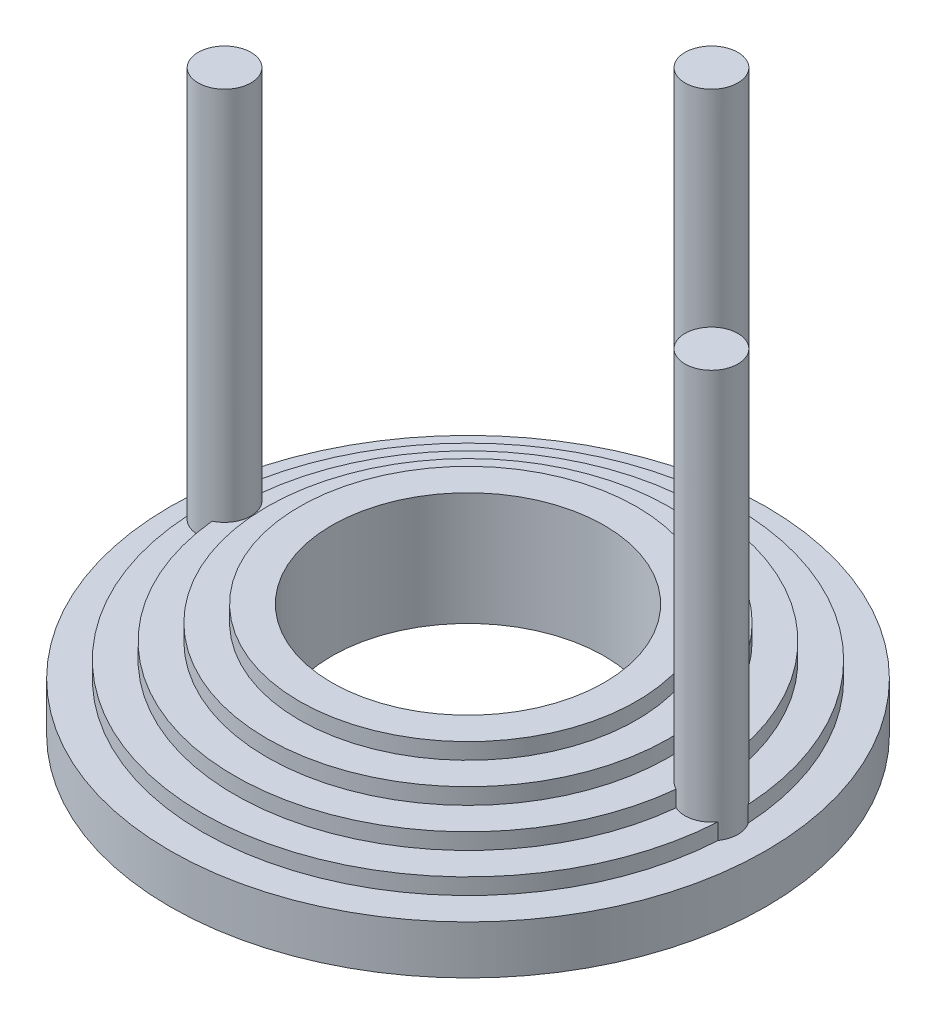
ISO-10303-21;
HEADER;
FILE_DESCRIPTION(('STEP AP214'),'2;1');
FILE_NAME('part.step','',(''),(''),'','','');
FILE_SCHEMA(('AUTOMOTIVE_DESIGN { 1 0 10303 214 1 1 1 1 }'));
ENDSEC;
DATA;
#1=APPLICATION_CONTEXT('core data for automotive mechanical design processes');
#2=APPLICATION_PROTOCOL_DEFINITION('international standard','automotive_design',2000,#1);
#3=PRODUCT_CONTEXT('',#1,'mechanical');
#4=PRODUCT('Part','Part','',(#3));
#5=PRODUCT_RELATED_PRODUCT_CATEGORY('part','',(#4));
#6=PRODUCT_DEFINITION_FORMATION('','',#4);
#7=PRODUCT_DEFINITION_CONTEXT('part definition',#1,'design');
#8=PRODUCT_DEFINITION('design','',#6,#7);
#9=PRODUCT_DEFINITION_SHAPE('','',#8);
#10=(LENGTH_UNIT() NAMED_UNIT(*) SI_UNIT(.MILLI.,.METRE.));
#11=(NAMED_UNIT(*) PLANE_ANGLE_UNIT() SI_UNIT($,.RADIAN.));
#12=(NAMED_UNIT(*) SI_UNIT($,.STERADIAN.) SOLID_ANGLE_UNIT());
#13=UNCERTAINTY_MEASURE_WITH_UNIT(LENGTH_MEASURE(1.E-05),#10,'distance_accuracy_value','');
#14=(GEOMETRIC_REPRESENTATION_CONTEXT(3) GLOBAL_UNCERTAINTY_ASSIGNED_CONTEXT((#13)) GLOBAL_UNIT_ASSIGNED_CONTEXT((#10,
#11,#12)) REPRESENTATION_CONTEXT('',''));
#15=CARTESIAN_POINT('',(0.,0.,0.));
#16=DIRECTION('',(0.,0.,1.));
#17=DIRECTION('',(1.,0.,0.));
#18=AXIS2_PLACEMENT_3D('',#15,#16,#17);
#19=CARTESIAN_POINT('',(-63.74799991,23.4540505717349,0.));
#20=DIRECTION('',(0.,-1.,0.));
#21=DIRECTION('',(0.,0.,-1.));
#22=AXIS2_PLACEMENT_3D('',#19,#20,#21);
#23=PLANE('',#22);
#24=CARTESIAN_POINT('',(0.,23.4540505717349,0.));
#25=DIRECTION('',(0.,-1.,0.));
#26=DIRECTION('',(0.,0.,-1.));
#27=AXIS2_PLACEMENT_3D('',#24,#25,#26);
#28=CIRCLE('',#27,71.50999988);
#29=CARTESIAN_POINT('',(0.,23.4540505717349,-71.50999988));
#30=VERTEX_POINT('',#29);
#31=EDGE_CURVE('E217',#30,#30,#28,.T.);
#32=ORIENTED_EDGE('',*,*,#31,.F.);
#33=EDGE_LOOP('',(#32));
#34=FACE_BOUND('',#33,.T.);
#35=CARTESIAN_POINT('',(0.,23.4540505717349,-58.42));
#36=DIRECTION('',(0.,1.,0.));
#37=DIRECTION('',(0.,0.,1.));
#38=AXIS2_PLACEMENT_3D('',#35,#36,#37);
#39=CIRCLE('',#38,6.35);
#40=CARTESIAN_POINT('',(3.60734900758684,23.4540505717349,-63.6458523838186));
#41=VERTEX_POINT('',#40);
#42=CARTESIAN_POINT('',(-3.60734900758684,23.4540505717349,-63.6458523838186));
#43=VERTEX_POINT('',#42);
#44=EDGE_CURVE('E47',#41,#43,#39,.T.);
#45=ORIENTED_EDGE('',*,*,#44,.F.);
#46=CARTESIAN_POINT('',(0.,23.4540505717349,0.));
#47=DIRECTION('',(0.,-1.,0.));
#48=DIRECTION('',(0.,0.,-1.));
#49=AXIS2_PLACEMENT_3D('',#46,#47,#48);
#50=CIRCLE('',#49,63.74799991);
#51=CARTESIAN_POINT('',(63.6458523838186,23.4540505717349,-3.60734900758684));
#52=VERTEX_POINT('',#51);
#53=EDGE_CURVE('E218',#41,#52,#50,.T.);
#54=ORIENTED_EDGE('',*,*,#53,.T.);
#55=CARTESIAN_POINT('',(58.42,23.4540505717349,0.));
#56=DIRECTION('',(0.,1.,0.));
#57=DIRECTION('',(0.,0.,-1.));
#58=AXIS2_PLACEMENT_3D('',#55,#56,#57);
#59=CIRCLE('',#58,6.35);
#60=CARTESIAN_POINT('',(63.6458523838186,23.4540505717349,3.60734900758684));
#61=VERTEX_POINT('',#60);
#62=EDGE_CURVE('E161',#61,#52,#59,.T.);
#63=ORIENTED_EDGE('',*,*,#62,.F.);
#64=CARTESIAN_POINT('',(-63.6458523838186,23.4540505717349,3.60734900758684));
#65=VERTEX_POINT('',#64);
#66=EDGE_CURVE('E213',#61,#65,#50,.T.);
#67=ORIENTED_EDGE('',*,*,#66,.T.);
#68=CARTESIAN_POINT('',(-58.42,23.4540505717349,0.));
#69=DIRECTION('',(0.,1.,0.));
#70=DIRECTION('',(0.,0.,1.));
#71=AXIS2_PLACEMENT_3D('',#68,#69,#70);
#72=CIRCLE('',#71,6.35);
#73=CARTESIAN_POINT('',(-63.6458523838186,23.4540505717349,-3.60734900758684));
#74=VERTEX_POINT('',#73);
#75=EDGE_CURVE('E182',#74,#65,#72,.T.);
#76=ORIENTED_EDGE('',*,*,#75,.F.);
#77=EDGE_CURVE('E215',#74,#43,#50,.T.);
#78=ORIENTED_EDGE('',*,*,#77,.T.);
#79=EDGE_LOOP('',(#45,#54,#63,#67,#76,#78));
#80=FACE_BOUND('',#79,.T.);
#81=ADVANCED_FACE('F32',(#34,#80),#23,.F.);
#82=CARTESIAN_POINT('',(0.,0.,0.));
#83=DIRECTION('',(0.,-1.,0.));
#84=DIRECTION('',(0.,0.,-1.));
#85=AXIS2_PLACEMENT_3D('',#82,#83,#84);
#86=CYLINDRICAL_SURFACE('',#85,63.74799991);
#87=DIRECTION('',(0.,-1.,0.));
#88=VECTOR('',#87,1.);
#89=CARTESIAN_POINT('',(3.60734900758683,72.3490505717349,-63.6458523838186));
#90=LINE('',#89,#88);
#91=CARTESIAN_POINT('',(3.60734900758683,27.3350505717349,-63.6458523838186));
#92=VERTEX_POINT('',#91);
#93=EDGE_CURVE('E158',#92,#41,#90,.T.);
#94=ORIENTED_EDGE('',*,*,#93,.F.);
#95=CARTESIAN_POINT('',(0.,27.3350505717349,0.));
#96=DIRECTION('',(0.,-1.,0.));
#97=DIRECTION('',(0.,0.,-1.));
#98=AXIS2_PLACEMENT_3D('',#95,#96,#97);
#99=CIRCLE('',#98,63.74799991);
#100=CARTESIAN_POINT('',(63.6458523838186,27.3350505717349,-3.60734900758683));
#101=VERTEX_POINT('',#100);
#102=EDGE_CURVE('E214',#92,#101,#99,.T.);
#103=ORIENTED_EDGE('',*,*,#102,.T.);
#104=DIRECTION('',(0.,-1.,0.));
#105=VECTOR('',#104,1.);
#106=CARTESIAN_POINT('',(63.6458523838186,72.3490505717349,-3.60734900758684));
#107=LINE('',#106,#105);
#108=EDGE_CURVE('E176',#52,#101,#107,.F.);
#109=ORIENTED_EDGE('',*,*,#108,.F.);
#110=ORIENTED_EDGE('',*,*,#53,.F.);
#111=EDGE_LOOP('',(#94,#103,#109,#110));
#112=FACE_BOUND('',#111,.T.);
#113=ADVANCED_FACE('F267',(#112),#86,.T.);
#114=DIRECTION('',(0.,-1.,0.));
#115=VECTOR('',#114,1.);
#116=CARTESIAN_POINT('',(-3.60734900758683,72.3490505717349,-63.6458523838186));
#117=LINE('',#116,#115);
#118=CARTESIAN_POINT('',(-3.60734900758683,27.3350505717349,-63.6458523838186));
#119=VERTEX_POINT('',#118);
#120=EDGE_CURVE('E55',#43,#119,#117,.F.);
#121=ORIENTED_EDGE('',*,*,#120,.F.);
#122=ORIENTED_EDGE('',*,*,#77,.F.);
#123=DIRECTION('',(0.,-1.,0.));
#124=VECTOR('',#123,1.);
#125=CARTESIAN_POINT('',(-63.6458523838186,72.3490505717349,-3.60734900758684));
#126=LINE('',#125,#124);
#127=CARTESIAN_POINT('',(-63.6458523838186,27.3350505717349,-3.60734900758683));
#128=VERTEX_POINT('',#127);
#129=EDGE_CURVE('E201',#128,#74,#126,.T.);
#130=ORIENTED_EDGE('',*,*,#129,.F.);
#131=EDGE_CURVE('E211',#128,#119,#99,.T.);
#132=ORIENTED_EDGE('',*,*,#131,.T.);
#133=EDGE_LOOP('',(#121,#122,#130,#132));
#134=FACE_BOUND('',#133,.T.);
#135=ADVANCED_FACE('F268',(#134),#86,.T.);
#136=CARTESIAN_POINT('',(-55.98599994,27.3350505717349,0.));
#137=DIRECTION('',(0.,-1.,0.));
#138=DIRECTION('',(0.,0.,-1.));
#139=AXIS2_PLACEMENT_3D('',#136,#137,#138);
#140=PLANE('',#139);
#141=CARTESIAN_POINT('',(0.,27.3350505717349,-58.42));
#142=DIRECTION('',(0.,-1.,0.));
#143=DIRECTION('',(0.,0.,-1.));
#144=AXIS2_PLACEMENT_3D('',#141,#142,#143);
#145=CIRCLE('',#144,6.35);
#146=CARTESIAN_POINT('',(-5.73396130115922,27.3350505717349,-55.6915961081965));
#147=VERTEX_POINT('',#146);
#148=EDGE_CURVE('E146',#119,#147,#145,.F.);
#149=ORIENTED_EDGE('',*,*,#148,.F.);
#150=ORIENTED_EDGE('',*,*,#131,.F.);
#151=CARTESIAN_POINT('',(-58.42,27.3350505717349,0.));
#152=DIRECTION('',(0.,-1.,0.));
#153=DIRECTION('',(0.,0.,-1.));
#154=AXIS2_PLACEMENT_3D('',#151,#152,#153);
#155=CIRCLE('',#154,6.35);
#156=CARTESIAN_POINT('',(-55.6915961081965,27.3350505717349,-5.73396130115923));
#157=VERTEX_POINT('',#156);
#158=EDGE_CURVE('E194',#157,#128,#155,.F.);
#159=ORIENTED_EDGE('',*,*,#158,.F.);
#160=CARTESIAN_POINT('',(0.,27.3350505717349,0.));
#161=DIRECTION('',(0.,-1.,0.));
#162=DIRECTION('',(0.,0.,-1.));
#163=AXIS2_PLACEMENT_3D('',#160,#161,#162);
#164=CIRCLE('',#163,55.98599994);
#165=EDGE_CURVE('E208',#157,#147,#164,.T.);
#166=ORIENTED_EDGE('',*,*,#165,.T.);
#167=EDGE_LOOP('',(#149,#150,#159,#166));
#168=FACE_BOUND('',#167,.T.);
#169=ADVANCED_FACE('F272',(#168),#140,.F.);
#170=CARTESIAN_POINT('',(5.73396130115922,27.3350505717349,-55.6915961081965));
#171=VERTEX_POINT('',#170);
#172=EDGE_CURVE('E140',#171,#92,#145,.F.);
#173=ORIENTED_EDGE('',*,*,#172,.F.);
#174=CARTESIAN_POINT('',(55.6915961081965,27.3350505717349,-5.73396130115923));
#175=VERTEX_POINT('',#174);
#176=EDGE_CURVE('E137',#171,#175,#164,.T.);
#177=ORIENTED_EDGE('',*,*,#176,.T.);
#178=CARTESIAN_POINT('',(58.42,27.3350505717349,0.));
#179=DIRECTION('',(0.,-1.,0.));
#180=DIRECTION('',(0.,0.,-1.));
#181=AXIS2_PLACEMENT_3D('',#178,#179,#180);
#182=CIRCLE('',#181,6.35);
#183=EDGE_CURVE('E172',#101,#175,#182,.F.);
#184=ORIENTED_EDGE('',*,*,#183,.F.);
#185=ORIENTED_EDGE('',*,*,#102,.F.);
#186=EDGE_LOOP('',(#173,#177,#184,#185));
#187=FACE_BOUND('',#186,.T.);
#188=ADVANCED_FACE('F249',(#187),#140,.F.);
#189=CARTESIAN_POINT('',(0.,0.,0.));
#190=DIRECTION('',(0.,-1.,0.));
#191=DIRECTION('',(0.,0.,-1.));
#192=AXIS2_PLACEMENT_3D('',#189,#190,#191);
#193=CYLINDRICAL_SURFACE('',#192,55.98599994);
#194=DIRECTION('',(0.,-1.,0.));
#195=VECTOR('',#194,1.);
#196=CARTESIAN_POINT('',(5.73396130115922,72.3490505717349,-55.6915961081965));
#197=LINE('',#196,#195);
#198=CARTESIAN_POINT('',(5.7339613011592,31.2160506837349,-55.6915961081965));
#199=VERTEX_POINT('',#198);
#200=EDGE_CURVE('E135',#199,#171,#197,.T.);
#201=ORIENTED_EDGE('',*,*,#200,.F.);
#202=CARTESIAN_POINT('',(0.,31.2160506837349,0.));
#203=DIRECTION('',(0.,-1.,0.));
#204=DIRECTION('',(0.,0.,-1.));
#205=AXIS2_PLACEMENT_3D('',#202,#203,#204);
#206=CIRCLE('',#205,55.98599994);
#207=CARTESIAN_POINT('',(55.6915961081965,31.2160506837349,-5.7339613011592));
#208=VERTEX_POINT('',#207);
#209=EDGE_CURVE('E122',#199,#208,#206,.T.);
#210=ORIENTED_EDGE('',*,*,#209,.T.);
#211=DIRECTION('',(0.,-1.,0.));
#212=VECTOR('',#211,1.);
#213=CARTESIAN_POINT('',(55.6915961081965,72.3490505717349,-5.73396130115923));
#214=LINE('',#213,#212);
#215=EDGE_CURVE('E165',#175,#208,#214,.F.);
#216=ORIENTED_EDGE('',*,*,#215,.F.);
#217=ORIENTED_EDGE('',*,*,#176,.F.);
#218=EDGE_LOOP('',(#201,#210,#216,#217));
#219=FACE_BOUND('',#218,.T.);
#220=ADVANCED_FACE('F136',(#219),#193,.T.);
#221=DIRECTION('',(0.,-1.,0.));
#222=VECTOR('',#221,1.);
#223=CARTESIAN_POINT('',(-5.73396130115922,72.3490505717349,-55.6915961081965));
#224=LINE('',#223,#222);
#225=CARTESIAN_POINT('',(-5.7339613011592,31.2160506837349,-55.6915961081965));
#226=VERTEX_POINT('',#225);
#227=EDGE_CURVE('E141',#147,#226,#224,.F.);
#228=ORIENTED_EDGE('',*,*,#227,.F.);
#229=ORIENTED_EDGE('',*,*,#165,.F.);
#230=DIRECTION('',(0.,-1.,0.));
#231=VECTOR('',#230,1.);
#232=CARTESIAN_POINT('',(-55.6915961081965,72.3490505717349,-5.73396130115923));
#233=LINE('',#232,#231);
#234=CARTESIAN_POINT('',(-55.6915961081965,31.2160506837349,-5.7339613011592));
#235=VERTEX_POINT('',#234);
#236=EDGE_CURVE('E191',#235,#157,#233,.T.);
#237=ORIENTED_EDGE('',*,*,#236,.F.);
#238=EDGE_CURVE('E130',#235,#226,#206,.T.);
#239=ORIENTED_EDGE('',*,*,#238,.T.);
#240=EDGE_LOOP('',(#228,#229,#237,#239));
#241=FACE_BOUND('',#240,.T.);
#242=ADVANCED_FACE('F273',(#241),#193,.T.);
#243=CARTESIAN_POINT('',(-48.22399997,31.2160506837349,0.));
#244=DIRECTION('',(0.,-1.,0.));
#245=DIRECTION('',(0.,0.,-1.));
#246=AXIS2_PLACEMENT_3D('',#243,#244,#245);
#247=PLANE('',#246);
#248=CARTESIAN_POINT('',(0.,31.2160506837349,0.));
#249=DIRECTION('',(0.,-1.,0.));
#250=DIRECTION('',(0.,0.,-1.));
#251=AXIS2_PLACEMENT_3D('',#248,#249,#250);
#252=CIRCLE('',#251,48.22399997);
#253=CARTESIAN_POINT('',(0.,31.2160506837349,-48.22399997));
#254=VERTEX_POINT('',#253);
#255=EDGE_CURVE('E204',#254,#254,#252,.T.);
#256=ORIENTED_EDGE('',*,*,#255,.T.);
#257=EDGE_LOOP('',(#256));
#258=FACE_BOUND('',#257,.T.);
#259=CARTESIAN_POINT('',(0.,31.2160506837349,-58.42));
#260=DIRECTION('',(0.,-1.,0.));
#261=DIRECTION('',(0.,0.,-1.));
#262=AXIS2_PLACEMENT_3D('',#259,#260,#261);
#263=CIRCLE('',#262,6.35);
#264=EDGE_CURVE('E11',#226,#199,#263,.F.);
#265=ORIENTED_EDGE('',*,*,#264,.F.);
#266=ORIENTED_EDGE('',*,*,#238,.F.);
#267=CARTESIAN_POINT('',(-58.42,31.2160506837349,0.));
#268=DIRECTION('',(0.,-1.,0.));
#269=DIRECTION('',(0.,0.,-1.));
#270=AXIS2_PLACEMENT_3D('',#267,#268,#269);
#271=CIRCLE('',#270,6.35);
#272=CARTESIAN_POINT('',(-55.6915961081965,31.2160506837349,5.7339613011592));
#273=VERTEX_POINT('',#272);
#274=EDGE_CURVE('E239',#273,#235,#271,.F.);
#275=ORIENTED_EDGE('',*,*,#274,.F.);
#276=CARTESIAN_POINT('',(55.6915961081965,31.2160506837349,5.7339613011592));
#277=VERTEX_POINT('',#276);
#278=EDGE_CURVE('E131',#277,#273,#206,.T.);
#279=ORIENTED_EDGE('',*,*,#278,.F.);
#280=CARTESIAN_POINT('',(58.42,31.2160506837349,0.));
#281=DIRECTION('',(0.,-1.,0.));
#282=DIRECTION('',(0.,0.,-1.));
#283=AXIS2_PLACEMENT_3D('',#280,#281,#282);
#284=CIRCLE('',#283,6.35);
#285=EDGE_CURVE('E40',#208,#277,#284,.F.);
#286=ORIENTED_EDGE('',*,*,#285,.F.);
#287=ORIENTED_EDGE('',*,*,#209,.F.);
#288=EDGE_LOOP('',(#265,#266,#275,#279,#286,#287));
#289=FACE_BOUND('',#288,.T.);
#290=ADVANCED_FACE('F124',(#258,#289),#247,.F.);
#291=DIRECTION('',(0.,-1.,0.));
#292=VECTOR('',#291,1.);
#293=CARTESIAN_POINT('',(63.6458523838186,72.3490505717349,3.60734900758684));
#294=LINE('',#293,#292);
#295=CARTESIAN_POINT('',(63.6458523838186,27.3350505717349,3.60734900758683));
#296=VERTEX_POINT('',#295);
#297=EDGE_CURVE('E179',#296,#61,#294,.T.);
#298=ORIENTED_EDGE('',*,*,#297,.F.);
#299=CARTESIAN_POINT('',(-63.6458523838186,27.3350505717349,3.60734900758683));
#300=VERTEX_POINT('',#299);
#301=EDGE_CURVE('E210',#296,#300,#99,.T.);
#302=ORIENTED_EDGE('',*,*,#301,.T.);
#303=DIRECTION('',(0.,-1.,0.));
#304=VECTOR('',#303,1.);
#305=CARTESIAN_POINT('',(-63.6458523838186,72.3490505717349,3.60734900758684));
#306=LINE('',#305,#304);
#307=EDGE_CURVE('E198',#65,#300,#306,.F.);
#308=ORIENTED_EDGE('',*,*,#307,.F.);
#309=ORIENTED_EDGE('',*,*,#66,.F.);
#310=EDGE_LOOP('',(#298,#302,#308,#309));
#311=FACE_BOUND('',#310,.T.);
#312=ADVANCED_FACE('F265',(#311),#86,.T.);
#313=CARTESIAN_POINT('',(55.6915961081965,27.3350505717349,5.73396130115923));
#314=VERTEX_POINT('',#313);
#315=EDGE_CURVE('E175',#314,#296,#182,.F.);
#316=ORIENTED_EDGE('',*,*,#315,.F.);
#317=CARTESIAN_POINT('',(-55.6915961081965,27.3350505717349,5.73396130115923));
#318=VERTEX_POINT('',#317);
#319=EDGE_CURVE('E207',#314,#318,#164,.T.);
#320=ORIENTED_EDGE('',*,*,#319,.T.);
#321=EDGE_CURVE('E197',#300,#318,#155,.F.);
#322=ORIENTED_EDGE('',*,*,#321,.F.);
#323=ORIENTED_EDGE('',*,*,#301,.F.);
#324=EDGE_LOOP('',(#316,#320,#322,#323));
#325=FACE_BOUND('',#324,.T.);
#326=ADVANCED_FACE('F254',(#325),#140,.F.);
#327=DIRECTION('',(0.,-1.,0.));
#328=VECTOR('',#327,1.);
#329=CARTESIAN_POINT('',(55.6915961081965,72.3490505717349,5.73396130115923));
#330=LINE('',#329,#328);
#331=EDGE_CURVE('E169',#277,#314,#330,.T.);
#332=ORIENTED_EDGE('',*,*,#331,.F.);
#333=ORIENTED_EDGE('',*,*,#278,.T.);
#334=DIRECTION('',(0.,-1.,0.));
#335=VECTOR('',#334,1.);
#336=CARTESIAN_POINT('',(-55.6915961081965,72.3490505717349,5.73396130115923));
#337=LINE('',#336,#335);
#338=EDGE_CURVE('E186',#318,#273,#337,.F.);
#339=ORIENTED_EDGE('',*,*,#338,.F.);
#340=ORIENTED_EDGE('',*,*,#319,.F.);
#341=EDGE_LOOP('',(#332,#333,#339,#340));
#342=FACE_BOUND('',#341,.T.);
#343=ADVANCED_FACE('F258',(#342),#193,.T.);
#344=CARTESIAN_POINT('',(0.,0.,0.));
#345=DIRECTION('',(0.,-1.,0.));
#346=DIRECTION('',(0.,0.,-1.));
#347=AXIS2_PLACEMENT_3D('',#344,#345,#346);
#348=CYLINDRICAL_SURFACE('',#347,48.22399997);
#349=ORIENTED_EDGE('',*,*,#255,.F.);
#350=EDGE_LOOP('',(#349));
#351=FACE_BOUND('',#350,.T.);
#352=CARTESIAN_POINT('',(0.,35.0970507957349,0.));
#353=DIRECTION('',(0.,-1.,0.));
#354=DIRECTION('',(0.,0.,-1.));
#355=AXIS2_PLACEMENT_3D('',#352,#353,#354);
#356=CIRCLE('',#355,48.22399997);
#357=CARTESIAN_POINT('',(0.,35.0970507957349,-48.22399997));
#358=VERTEX_POINT('',#357);
#359=EDGE_CURVE('E236',#358,#358,#356,.T.);
#360=ORIENTED_EDGE('',*,*,#359,.T.);
#361=EDGE_LOOP('',(#360));
#362=FACE_BOUND('',#361,.T.);
#363=ADVANCED_FACE('F34',(#351,#362),#348,.T.);
#364=CARTESIAN_POINT('',(-48.22399997,35.0970507957349,0.));
#365=DIRECTION('',(0.,-1.,0.));
#366=DIRECTION('',(0.,0.,-1.));
#367=AXIS2_PLACEMENT_3D('',#364,#365,#366);
#368=PLANE('',#367);
#369=ORIENTED_EDGE('',*,*,#359,.F.);
#370=EDGE_LOOP('',(#369));
#371=FACE_BOUND('',#370,.T.);
#372=CARTESIAN_POINT('',(0.,35.0970507957349,0.));
#373=DIRECTION('',(0.,-1.,0.));
#374=DIRECTION('',(0.,0.,-1.));
#375=AXIS2_PLACEMENT_3D('',#372,#373,#374);
#376=CIRCLE('',#375,40.462);
#377=CARTESIAN_POINT('',(0.,35.0970507957349,-40.462));
#378=VERTEX_POINT('',#377);
#379=EDGE_CURVE('E233',#378,#378,#376,.T.);
#380=ORIENTED_EDGE('',*,*,#379,.T.);
#381=EDGE_LOOP('',(#380));
#382=FACE_BOUND('',#381,.T.);
#383=ADVANCED_FACE('F311',(#371,#382),#368,.F.);
#384=CARTESIAN_POINT('',(0.,0.,0.));
#385=DIRECTION('',(0.,-1.,0.));
#386=DIRECTION('',(0.,0.,-1.));
#387=AXIS2_PLACEMENT_3D('',#384,#385,#386);
#388=CYLINDRICAL_SURFACE('',#387,40.462);
#389=ORIENTED_EDGE('',*,*,#379,.F.);
#390=EDGE_LOOP('',(#389));
#391=FACE_BOUND('',#390,.T.);
#392=CARTESIAN_POINT('',(0.,38.9780509077349,0.));
#393=DIRECTION('',(0.,-1.,0.));
#394=DIRECTION('',(0.,0.,-1.));
#395=AXIS2_PLACEMENT_3D('',#392,#393,#394);
#396=CIRCLE('',#395,40.462);
#397=CARTESIAN_POINT('',(0.,38.9780509077349,-40.462));
#398=VERTEX_POINT('',#397);
#399=EDGE_CURVE('E230',#398,#398,#396,.T.);
#400=ORIENTED_EDGE('',*,*,#399,.T.);
#401=EDGE_LOOP('',(#400));
#402=FACE_BOUND('',#401,.T.);
#403=ADVANCED_FACE('F308',(#391,#402),#388,.T.);
#404=CARTESIAN_POINT('',(-40.462,38.9780509077349,0.));
#405=DIRECTION('',(0.,-1.,0.));
#406=DIRECTION('',(0.,0.,-1.));
#407=AXIS2_PLACEMENT_3D('',#404,#405,#406);
#408=PLANE('',#407);
#409=ORIENTED_EDGE('',*,*,#399,.F.);
#410=EDGE_LOOP('',(#409));
#411=FACE_BOUND('',#410,.T.);
#412=CARTESIAN_POINT('',(0.,38.9780509077349,0.));
#413=DIRECTION('',(0.,-1.,0.));
#414=DIRECTION('',(0.,0.,-1.));
#415=AXIS2_PLACEMENT_3D('',#412,#413,#414);
#416=CIRCLE('',#415,32.7);
#417=CARTESIAN_POINT('',(0.,38.9780509077349,-32.7));
#418=VERTEX_POINT('',#417);
#419=EDGE_CURVE('E227',#418,#418,#416,.T.);
#420=ORIENTED_EDGE('',*,*,#419,.T.);
#421=EDGE_LOOP('',(#420));
#422=FACE_BOUND('',#421,.T.);
#423=ADVANCED_FACE('F304',(#411,#422),#408,.F.);
#424=CARTESIAN_POINT('',(0.,0.,0.));
#425=DIRECTION('',(0.,-1.,0.));
#426=DIRECTION('',(0.,0.,-1.));
#427=AXIS2_PLACEMENT_3D('',#424,#425,#426);
#428=CYLINDRICAL_SURFACE('',#427,32.7);
#429=ORIENTED_EDGE('',*,*,#419,.F.);
#430=EDGE_LOOP('',(#429));
#431=FACE_BOUND('',#430,.T.);
#432=CARTESIAN_POINT('',(0.,11.8110505717349,0.));
#433=DIRECTION('',(0.,-1.,0.));
#434=DIRECTION('',(0.,0.,-1.));
#435=AXIS2_PLACEMENT_3D('',#432,#433,#434);
#436=CIRCLE('',#435,32.7);
#437=CARTESIAN_POINT('',(0.,11.8110505717349,-32.7));
#438=VERTEX_POINT('',#437);
#439=EDGE_CURVE('E224',#438,#438,#436,.T.);
#440=ORIENTED_EDGE('',*,*,#439,.T.);
#441=EDGE_LOOP('',(#440));
#442=FACE_BOUND('',#441,.T.);
#443=ADVANCED_FACE('F300',(#431,#442),#428,.F.);
#444=CARTESIAN_POINT('',(-71.50999988,11.8110505717349,0.));
#445=DIRECTION('',(0.,1.,0.));
#446=DIRECTION('',(0.,0.,1.));
#447=AXIS2_PLACEMENT_3D('',#444,#445,#446);
#448=PLANE('',#447);
#449=ORIENTED_EDGE('',*,*,#439,.F.);
#450=EDGE_LOOP('',(#449));
#451=FACE_BOUND('',#450,.T.);
#452=CARTESIAN_POINT('',(0.,11.8110505717349,0.));
#453=DIRECTION('',(0.,-1.,0.));
#454=DIRECTION('',(0.,0.,-1.));
#455=AXIS2_PLACEMENT_3D('',#452,#453,#454);
#456=CIRCLE('',#455,71.50999988);
#457=CARTESIAN_POINT('',(0.,11.8110505717349,-71.50999988));
#458=VERTEX_POINT('',#457);
#459=EDGE_CURVE('E221',#458,#458,#456,.T.);
#460=ORIENTED_EDGE('',*,*,#459,.T.);
#461=EDGE_LOOP('',(#460));
#462=FACE_BOUND('',#461,.T.);
#463=ADVANCED_FACE('F296',(#451,#462),#448,.F.);
#464=CARTESIAN_POINT('',(0.,0.,0.));
#465=DIRECTION('',(0.,-1.,0.));
#466=DIRECTION('',(0.,0.,-1.));
#467=AXIS2_PLACEMENT_3D('',#464,#465,#466);
#468=CYLINDRICAL_SURFACE('',#467,71.50999988);
#469=ORIENTED_EDGE('',*,*,#459,.F.);
#470=EDGE_LOOP('',(#469));
#471=FACE_BOUND('',#470,.T.);
#472=ORIENTED_EDGE('',*,*,#31,.T.);
#473=EDGE_LOOP('',(#472));
#474=FACE_BOUND('',#473,.T.);
#475=ADVANCED_FACE('F293',(#471,#474),#468,.T.);
#476=CARTESIAN_POINT('',(-58.42,121.244050571735,0.));
#477=DIRECTION('',(0.,-1.,0.));
#478=DIRECTION('',(0.,0.,-1.));
#479=AXIS2_PLACEMENT_3D('',#476,#477,#478);
#480=CYLINDRICAL_SURFACE('',#479,6.35);
#481=CARTESIAN_POINT('',(-58.42,121.244050571735,0.));
#482=DIRECTION('',(0.,1.,0.));
#483=DIRECTION('',(0.,0.,1.));
#484=AXIS2_PLACEMENT_3D('',#481,#482,#483);
#485=CIRCLE('',#484,6.35);
#486=CARTESIAN_POINT('',(-58.42,121.244050571735,6.35));
#487=VERTEX_POINT('',#486);
#488=EDGE_CURVE('E183',#487,#487,#485,.T.);
#489=ORIENTED_EDGE('',*,*,#488,.F.);
#490=EDGE_LOOP('',(#489));
#491=FACE_BOUND('',#490,.T.);
#492=ORIENTED_EDGE('',*,*,#158,.T.);
#493=ORIENTED_EDGE('',*,*,#129,.T.);
#494=ORIENTED_EDGE('',*,*,#75,.T.);
#495=ORIENTED_EDGE('',*,*,#307,.T.);
#496=ORIENTED_EDGE('',*,*,#321,.T.);
#497=ORIENTED_EDGE('',*,*,#338,.T.);
#498=ORIENTED_EDGE('',*,*,#274,.T.);
#499=ORIENTED_EDGE('',*,*,#236,.T.);
#500=EDGE_LOOP('',(#492,#493,#494,#495,#496,#497,#498,#499));
#501=FACE_BOUND('',#500,.T.);
#502=ADVANCED_FACE('F261',(#491,#501),#480,.T.);
#503=CARTESIAN_POINT('',(-58.42,121.244050571735,0.));
#504=DIRECTION('',(0.,1.,0.));
#505=DIRECTION('',(0.,0.,1.));
#506=AXIS2_PLACEMENT_3D('',#503,#504,#505);
#507=PLANE('',#506);
#508=ORIENTED_EDGE('',*,*,#488,.T.);
#509=EDGE_LOOP('',(#508));
#510=FACE_BOUND('',#509,.T.);
#511=ADVANCED_FACE('F442',(#510),#507,.T.);
#512=CARTESIAN_POINT('',(58.42,121.244050571735,0.));
#513=DIRECTION('',(0.,-1.,0.));
#514=DIRECTION('',(0.,0.,-1.));
#515=AXIS2_PLACEMENT_3D('',#512,#513,#514);
#516=CYLINDRICAL_SURFACE('',#515,6.35);
#517=CARTESIAN_POINT('',(58.42,121.244050571735,0.));
#518=DIRECTION('',(0.,1.,0.));
#519=DIRECTION('',(0.,0.,-1.));
#520=AXIS2_PLACEMENT_3D('',#517,#518,#519);
#521=CIRCLE('',#520,6.35);
#522=CARTESIAN_POINT('',(58.42,121.244050571735,-6.35));
#523=VERTEX_POINT('',#522);
#524=EDGE_CURVE('E162',#523,#523,#521,.T.);
#525=ORIENTED_EDGE('',*,*,#524,.F.);
#526=EDGE_LOOP('',(#525));
#527=FACE_BOUND('',#526,.T.);
#528=ORIENTED_EDGE('',*,*,#315,.T.);
#529=ORIENTED_EDGE('',*,*,#297,.T.);
#530=ORIENTED_EDGE('',*,*,#62,.T.);
#531=ORIENTED_EDGE('',*,*,#108,.T.);
#532=ORIENTED_EDGE('',*,*,#183,.T.);
#533=ORIENTED_EDGE('',*,*,#215,.T.);
#534=ORIENTED_EDGE('',*,*,#285,.T.);
#535=ORIENTED_EDGE('',*,*,#331,.T.);
#536=EDGE_LOOP('',(#528,#529,#530,#531,#532,#533,#534,#535));
#537=FACE_BOUND('',#536,.T.);
#538=ADVANCED_FACE('F243',(#527,#537),#516,.T.);
#539=CARTESIAN_POINT('',(58.42,121.244050571735,0.));
#540=DIRECTION('',(0.,-1.,0.));
#541=DIRECTION('',(0.,0.,-1.));
#542=AXIS2_PLACEMENT_3D('',#539,#540,#541);
#543=PLANE('',#542);
#544=ORIENTED_EDGE('',*,*,#524,.T.);
#545=EDGE_LOOP('',(#544));
#546=FACE_BOUND('',#545,.T.);
#547=ADVANCED_FACE('F456',(#546),#543,.F.);
#548=CARTESIAN_POINT('',(0.,121.244050571735,-58.42));
#549=DIRECTION('',(0.,-1.,0.));
#550=DIRECTION('',(0.,0.,-1.));
#551=AXIS2_PLACEMENT_3D('',#548,#549,#550);
#552=CYLINDRICAL_SURFACE('',#551,6.35);
#553=CARTESIAN_POINT('',(0.,121.244050571735,-58.42));
#554=DIRECTION('',(0.,1.,0.));
#555=DIRECTION('',(0.,0.,1.));
#556=AXIS2_PLACEMENT_3D('',#553,#554,#555);
#557=CIRCLE('',#556,6.35);
#558=CARTESIAN_POINT('',(0.,121.244050571735,-52.07));
#559=VERTEX_POINT('',#558);
#560=EDGE_CURVE('E150',#559,#559,#557,.T.);
#561=ORIENTED_EDGE('',*,*,#560,.F.);
#562=EDGE_LOOP('',(#561));
#563=FACE_BOUND('',#562,.T.);
#564=ORIENTED_EDGE('',*,*,#172,.T.);
#565=ORIENTED_EDGE('',*,*,#93,.T.);
#566=ORIENTED_EDGE('',*,*,#44,.T.);
#567=ORIENTED_EDGE('',*,*,#120,.T.);
#568=ORIENTED_EDGE('',*,*,#148,.T.);
#569=ORIENTED_EDGE('',*,*,#227,.T.);
#570=ORIENTED_EDGE('',*,*,#264,.T.);
#571=ORIENTED_EDGE('',*,*,#200,.T.);
#572=EDGE_LOOP('',(#564,#565,#566,#567,#568,#569,#570,#571));
#573=FACE_BOUND('',#572,.T.);
#574=ADVANCED_FACE('F144',(#563,#573),#552,.T.);
#575=CARTESIAN_POINT('',(0.,121.244050571735,-58.42));
#576=DIRECTION('',(0.,1.,0.));
#577=DIRECTION('',(0.,0.,1.));
#578=AXIS2_PLACEMENT_3D('',#575,#576,#577);
#579=PLANE('',#578);
#580=ORIENTED_EDGE('',*,*,#560,.T.);
#581=EDGE_LOOP('',(#580));
#582=FACE_BOUND('',#581,.T.);
#583=ADVANCED_FACE('F471',(#582),#579,.T.);
#584=CLOSED_SHELL('',(#81,#113,#135,#169,#188,#220,#242,#290,#312,#326,#343,#363,#383,#403,#423,
#443,#463,#475,#502,#511,#538,#547,#574,#583));
#585=MANIFOLD_SOLID_BREP('B2',#584);
#586=ADVANCED_BREP_SHAPE_REPRESENTATION('',(#18,#585),#14);
#587=SHAPE_DEFINITION_REPRESENTATION(#9,#586);
ENDSEC;
END-ISO-10303-21;
